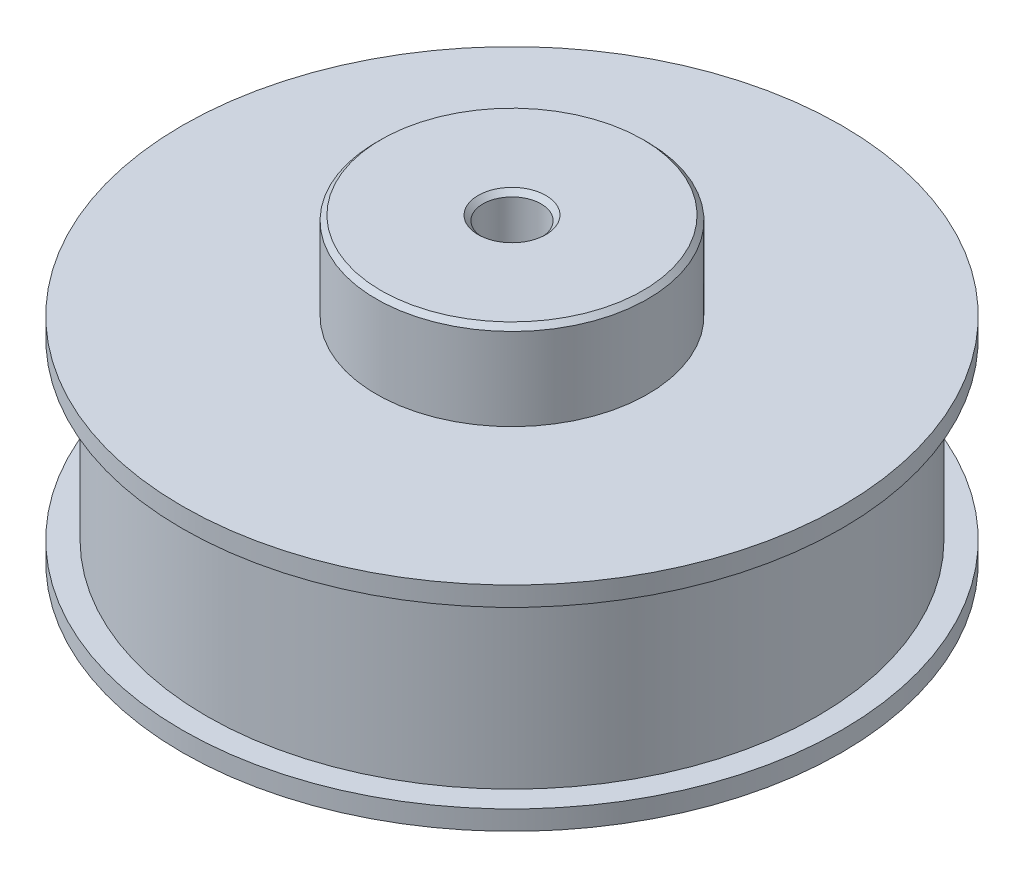
ISO-10303-21;
HEADER;
FILE_DESCRIPTION(('STEP AP214'),'2;1');
FILE_NAME('part.step','',(''),(''),'','','');
FILE_SCHEMA(('AUTOMOTIVE_DESIGN { 1 0 10303 214 1 1 1 1 }'));
ENDSEC;
DATA;
#1=APPLICATION_CONTEXT('core data for automotive mechanical design processes');
#2=APPLICATION_PROTOCOL_DEFINITION('international standard','automotive_design',2000,#1);
#3=PRODUCT_CONTEXT('',#1,'mechanical');
#4=PRODUCT('Part','Part','',(#3));
#5=PRODUCT_RELATED_PRODUCT_CATEGORY('part','',(#4));
#6=PRODUCT_DEFINITION_FORMATION('','',#4);
#7=PRODUCT_DEFINITION_CONTEXT('part definition',#1,'design');
#8=PRODUCT_DEFINITION('design','',#6,#7);
#9=PRODUCT_DEFINITION_SHAPE('','',#8);
#10=(LENGTH_UNIT() NAMED_UNIT(*) SI_UNIT(.MILLI.,.METRE.));
#11=(NAMED_UNIT(*) PLANE_ANGLE_UNIT() SI_UNIT($,.RADIAN.));
#12=(NAMED_UNIT(*) SI_UNIT($,.STERADIAN.) SOLID_ANGLE_UNIT());
#13=UNCERTAINTY_MEASURE_WITH_UNIT(LENGTH_MEASURE(1.E-05),#10,'distance_accuracy_value','');
#14=(GEOMETRIC_REPRESENTATION_CONTEXT(3) GLOBAL_UNCERTAINTY_ASSIGNED_CONTEXT((#13)) GLOBAL_UNIT_ASSIGNED_CONTEXT((#10,
#11,#12)) REPRESENTATION_CONTEXT('',''));
#15=CARTESIAN_POINT('',(0.,0.,0.));
#16=DIRECTION('',(0.,0.,1.));
#17=DIRECTION('',(1.,0.,0.));
#18=AXIS2_PLACEMENT_3D('',#15,#16,#17);
#19=CARTESIAN_POINT('',(0.,22.,0.));
#20=DIRECTION('',(0.,-1.,0.));
#21=DIRECTION('',(0.,0.,1.));
#22=AXIS2_PLACEMENT_3D('',#19,#20,#21);
#23=CYLINDRICAL_SURFACE('',#22,34.);
#24=CARTESIAN_POINT('',(0.,20.,0.));
#25=DIRECTION('',(0.,-1.,0.));
#26=DIRECTION('',(0.,0.,-1.));
#27=AXIS2_PLACEMENT_3D('',#24,#25,#26);
#28=CIRCLE('',#27,34.);
#29=CARTESIAN_POINT('',(0.,20.,-34.));
#30=VERTEX_POINT('',#29);
#31=EDGE_CURVE('E67',#30,#30,#28,.T.);
#32=ORIENTED_EDGE('',*,*,#31,.F.);
#33=EDGE_LOOP('',(#32));
#34=FACE_BOUND('',#33,.T.);
#35=CARTESIAN_POINT('',(0.,22.,0.));
#36=DIRECTION('',(0.,-1.,0.));
#37=DIRECTION('',(0.,0.,-1.));
#38=AXIS2_PLACEMENT_3D('',#35,#36,#37);
#39=CIRCLE('',#38,34.);
#40=CARTESIAN_POINT('',(0.,22.,-34.));
#41=VERTEX_POINT('',#40);
#42=EDGE_CURVE('E57',#41,#41,#39,.T.);
#43=ORIENTED_EDGE('',*,*,#42,.T.);
#44=EDGE_LOOP('',(#43));
#45=FACE_BOUND('',#44,.T.);
#46=ADVANCED_FACE('F37',(#34,#45),#23,.T.);
#47=CARTESIAN_POINT('',(0.,22.,0.));
#48=DIRECTION('',(0.,1.,0.));
#49=DIRECTION('',(0.,0.,-1.));
#50=AXIS2_PLACEMENT_3D('',#47,#48,#49);
#51=PLANE('',#50);
#52=CARTESIAN_POINT('',(0.,22.,0.));
#53=DIRECTION('',(0.,-1.,0.));
#54=DIRECTION('',(0.,0.,-1.));
#55=AXIS2_PLACEMENT_3D('',#52,#53,#54);
#56=CIRCLE('',#55,14.);
#57=CARTESIAN_POINT('',(0.,22.,-14.));
#58=VERTEX_POINT('',#57);
#59=EDGE_CURVE('E73',#58,#58,#56,.T.);
#60=ORIENTED_EDGE('',*,*,#59,.T.);
#61=EDGE_LOOP('',(#60));
#62=FACE_BOUND('',#61,.T.);
#63=ORIENTED_EDGE('',*,*,#42,.F.);
#64=EDGE_LOOP('',(#63));
#65=FACE_BOUND('',#64,.T.);
#66=ADVANCED_FACE('F98',(#62,#65),#51,.T.);
#67=CARTESIAN_POINT('',(0.,20.,0.));
#68=DIRECTION('',(0.,1.,0.));
#69=DIRECTION('',(0.,0.,-1.));
#70=AXIS2_PLACEMENT_3D('',#67,#68,#69);
#71=PLANE('',#70);
#72=CARTESIAN_POINT('',(0.,20.,0.));
#73=DIRECTION('',(0.,-1.,0.));
#74=DIRECTION('',(0.,0.,-1.));
#75=AXIS2_PLACEMENT_3D('',#72,#73,#74);
#76=CIRCLE('',#75,31.5);
#77=CARTESIAN_POINT('',(0.,20.,-31.5));
#78=VERTEX_POINT('',#77);
#79=EDGE_CURVE('E70',#78,#78,#76,.T.);
#80=ORIENTED_EDGE('',*,*,#79,.F.);
#81=EDGE_LOOP('',(#80));
#82=FACE_BOUND('',#81,.T.);
#83=ORIENTED_EDGE('',*,*,#31,.T.);
#84=EDGE_LOOP('',(#83));
#85=FACE_BOUND('',#84,.T.);
#86=ADVANCED_FACE('F105',(#82,#85),#71,.F.);
#87=CARTESIAN_POINT('',(0.,-96.1665222413705,0.));
#88=DIRECTION('',(0.,1.,0.));
#89=DIRECTION('',(0.,0.,-1.));
#90=AXIS2_PLACEMENT_3D('',#87,#88,#89);
#91=CYLINDRICAL_SURFACE('',#90,31.5);
#92=CARTESIAN_POINT('',(0.,2.,0.));
#93=DIRECTION('',(0.,-1.,0.));
#94=DIRECTION('',(0.,0.,-1.));
#95=AXIS2_PLACEMENT_3D('',#92,#93,#94);
#96=CIRCLE('',#95,31.5);
#97=CARTESIAN_POINT('',(0.,2.00000000000002,-31.5));
#98=VERTEX_POINT('',#97);
#99=EDGE_CURVE('E61',#98,#98,#96,.F.);
#100=CARTESIAN_POINT('',(0.,2.00000000000002,-31.5));
#101=CARTESIAN_POINT('',(0.,2.18750000000001,-31.5));
#102=CARTESIAN_POINT('',(0.,2.37500000000001,-31.5));
#103=CARTESIAN_POINT('',(0.,2.75000000000001,-31.5));
#104=CARTESIAN_POINT('',(0.,2.93750000000001,-31.5));
#105=CARTESIAN_POINT('',(0.,3.31250000000001,-31.5));
#106=CARTESIAN_POINT('',(0.,3.50000000000001,-31.5));
#107=CARTESIAN_POINT('',(0.,3.87500000000001,-31.5));
#108=CARTESIAN_POINT('',(0.,4.06250000000002,-31.5));
#109=CARTESIAN_POINT('',(0.,4.43750000000002,-31.5));
#110=CARTESIAN_POINT('',(0.,4.62500000000001,-31.5));
#111=CARTESIAN_POINT('',(0.,5.00000000000001,-31.5));
#112=CARTESIAN_POINT('',(0.,5.18750000000002,-31.5));
#113=CARTESIAN_POINT('',(0.,5.56250000000002,-31.5));
#114=CARTESIAN_POINT('',(0.,5.75000000000001,-31.5));
#115=CARTESIAN_POINT('',(0.,6.12500000000002,-31.5));
#116=CARTESIAN_POINT('',(0.,6.31250000000002,-31.5));
#117=CARTESIAN_POINT('',(0.,6.68750000000002,-31.5));
#118=CARTESIAN_POINT('',(0.,6.87500000000002,-31.5));
#119=CARTESIAN_POINT('',(0.,7.25000000000001,-31.5));
#120=CARTESIAN_POINT('',(0.,7.43750000000001,-31.5));
#121=CARTESIAN_POINT('',(0.,7.81250000000001,-31.5));
#122=CARTESIAN_POINT('',(0.,8.00000000000001,-31.5));
#123=CARTESIAN_POINT('',(0.,8.37500000000001,-31.5));
#124=CARTESIAN_POINT('',(0.,8.56250000000001,-31.5));
#125=CARTESIAN_POINT('',(0.,8.93750000000001,-31.5));
#126=CARTESIAN_POINT('',(0.,9.12500000000001,-31.5));
#127=CARTESIAN_POINT('',(0.,9.50000000000001,-31.5));
#128=CARTESIAN_POINT('',(0.,9.68750000000001,-31.5));
#129=CARTESIAN_POINT('',(0.,10.0625,-31.5));
#130=CARTESIAN_POINT('',(0.,10.25,-31.5));
#131=CARTESIAN_POINT('',(0.,10.625,-31.5));
#132=CARTESIAN_POINT('',(0.,10.8125,-31.5));
#133=CARTESIAN_POINT('',(0.,11.1875,-31.5));
#134=CARTESIAN_POINT('',(0.,11.375,-31.5));
#135=CARTESIAN_POINT('',(0.,11.75,-31.5));
#136=CARTESIAN_POINT('',(0.,11.9375,-31.5));
#137=CARTESIAN_POINT('',(0.,12.3125,-31.5));
#138=CARTESIAN_POINT('',(0.,12.5,-31.5));
#139=CARTESIAN_POINT('',(0.,12.875,-31.5));
#140=CARTESIAN_POINT('',(0.,13.0625,-31.5));
#141=CARTESIAN_POINT('',(0.,13.4375,-31.5));
#142=CARTESIAN_POINT('',(0.,13.625,-31.5));
#143=CARTESIAN_POINT('',(0.,14.,-31.5));
#144=CARTESIAN_POINT('',(0.,14.1875,-31.5));
#145=CARTESIAN_POINT('',(0.,14.5625,-31.5));
#146=CARTESIAN_POINT('',(0.,14.75,-31.5));
#147=CARTESIAN_POINT('',(0.,15.125,-31.5));
#148=CARTESIAN_POINT('',(0.,15.3125,-31.5));
#149=CARTESIAN_POINT('',(0.,15.6875,-31.5));
#150=CARTESIAN_POINT('',(0.,15.875,-31.5));
#151=CARTESIAN_POINT('',(0.,16.25,-31.5));
#152=CARTESIAN_POINT('',(0.,16.4375,-31.5));
#153=CARTESIAN_POINT('',(0.,16.8125,-31.5));
#154=CARTESIAN_POINT('',(0.,17.,-31.5));
#155=CARTESIAN_POINT('',(0.,17.375,-31.5));
#156=CARTESIAN_POINT('',(0.,17.5625,-31.5));
#157=CARTESIAN_POINT('',(0.,17.9375,-31.5));
#158=CARTESIAN_POINT('',(0.,18.125,-31.5));
#159=CARTESIAN_POINT('',(0.,18.5,-31.5));
#160=CARTESIAN_POINT('',(0.,18.6875,-31.5));
#161=CARTESIAN_POINT('',(0.,19.0625,-31.5));
#162=CARTESIAN_POINT('',(0.,19.25,-31.5));
#163=CARTESIAN_POINT('',(0.,19.625,-31.5));
#164=CARTESIAN_POINT('',(0.,19.8125,-31.5));
#165=CARTESIAN_POINT('',(0.,20.,-31.5));
#166=B_SPLINE_CURVE_WITH_KNOTS('',3,(#100,#101,#102,#103,#104,#105,#106,#107,#108,#109,#110,
#111,#112,#113,#114,#115,#116,#117,#118,#119,#120,#121,#122,#123,#124,#125,#126,#127,#128,#129,
#130,#131,#132,#133,#134,#135,#136,#137,#138,#139,#140,#141,#142,#143,#144,#145,#146,#147,#148,
#149,#150,#151,#152,#153,#154,#155,#156,#157,#158,#159,#160,#161,#162,#163,#164,#165),
.UNSPECIFIED.,.F.,.F.,(4,2,2,2,2,2,2,2,2,2,2,2,2,2,2,2,2,2,2,2,2,2,2,2,2,2,2,2,2,2,2,2,4),(0.,
0.562499999999994,1.125,1.68749999999999,2.25,2.8125,3.375,3.9375,4.5,5.0625,5.62499999999999,
6.1875,6.74999999999999,7.3125,7.87499999999999,8.43749999999999,8.99999999999999,9.5625,10.125,
10.6875,11.25,11.8125,12.375,12.9375,13.5,14.0625,14.625,15.1875,15.75,16.3125,16.875,17.4375,
18.),.UNSPECIFIED.);
#167=EDGE_CURVE('BSEAM127',#98,#78,#166,.T.);
#168=ORIENTED_EDGE('',*,*,#99,.T.);
#169=ORIENTED_EDGE('',*,*,#79,.T.);
#170=ORIENTED_EDGE('',*,*,#167,.T.);
#171=ORIENTED_EDGE('',*,*,#167,.F.);
#172=EDGE_LOOP('',(#168,#170,#169,#171));
#173=FACE_BOUND('',#172,.T.);
#174=ADVANCED_FACE('F127',(#173),#91,.T.);
#175=CARTESIAN_POINT('',(0.,2.,0.));
#176=DIRECTION('',(0.,1.,0.));
#177=DIRECTION('',(0.,0.,-1.));
#178=AXIS2_PLACEMENT_3D('',#175,#176,#177);
#179=PLANE('',#178);
#180=CARTESIAN_POINT('',(0.,2.,0.));
#181=DIRECTION('',(0.,-1.,0.));
#182=DIRECTION('',(0.,0.,-1.));
#183=AXIS2_PLACEMENT_3D('',#180,#181,#182);
#184=CIRCLE('',#183,34.);
#185=CARTESIAN_POINT('',(0.,2.,-34.));
#186=VERTEX_POINT('',#185);
#187=EDGE_CURVE('E66',#186,#186,#184,.F.);
#188=ORIENTED_EDGE('',*,*,#187,.T.);
#189=EDGE_LOOP('',(#188));
#190=FACE_BOUND('',#189,.T.);
#191=ORIENTED_EDGE('',*,*,#99,.F.);
#192=EDGE_LOOP('',(#191));
#193=FACE_BOUND('',#192,.T.);
#194=ADVANCED_FACE('F120',(#190,#193),#179,.T.);
#195=CARTESIAN_POINT('',(0.,0.,0.));
#196=DIRECTION('',(0.,1.,0.));
#197=DIRECTION('',(0.,0.,-1.));
#198=AXIS2_PLACEMENT_3D('',#195,#196,#197);
#199=PLANE('',#198);
#200=CARTESIAN_POINT('',(0.,0.,0.));
#201=DIRECTION('',(0.,-1.,0.));
#202=DIRECTION('',(0.,0.,-1.));
#203=AXIS2_PLACEMENT_3D('',#200,#201,#202);
#204=CIRCLE('',#203,3.);
#205=CARTESIAN_POINT('',(0.,0.,-3.));
#206=VERTEX_POINT('',#205);
#207=EDGE_CURVE('E78',#206,#206,#204,.F.);
#208=ORIENTED_EDGE('',*,*,#207,.T.);
#209=EDGE_LOOP('',(#208));
#210=FACE_BOUND('',#209,.T.);
#211=CARTESIAN_POINT('',(0.,0.,0.));
#212=DIRECTION('',(0.,-1.,0.));
#213=DIRECTION('',(0.,0.,-1.));
#214=AXIS2_PLACEMENT_3D('',#211,#212,#213);
#215=CIRCLE('',#214,34.);
#216=CARTESIAN_POINT('',(0.,0.,-34.));
#217=VERTEX_POINT('',#216);
#218=EDGE_CURVE('E58',#217,#217,#215,.T.);
#219=ORIENTED_EDGE('',*,*,#218,.T.);
#220=EDGE_LOOP('',(#219));
#221=FACE_BOUND('',#220,.T.);
#222=ADVANCED_FACE('F82',(#210,#221),#199,.F.);
#223=ORIENTED_EDGE('',*,*,#218,.F.);
#224=EDGE_LOOP('',(#223));
#225=FACE_BOUND('',#224,.T.);
#226=ORIENTED_EDGE('',*,*,#187,.F.);
#227=EDGE_LOOP('',(#226));
#228=FACE_BOUND('',#227,.T.);
#229=ADVANCED_FACE('F101',(#225,#228),#23,.T.);
#230=CARTESIAN_POINT('',(0.,31.,0.));
#231=DIRECTION('',(0.,-1.,0.));
#232=DIRECTION('',(0.,0.,1.));
#233=AXIS2_PLACEMENT_3D('',#230,#231,#232);
#234=CYLINDRICAL_SURFACE('',#233,14.);
#235=CARTESIAN_POINT('',(0.,30.5,0.));
#236=DIRECTION('',(0.,-1.,0.));
#237=DIRECTION('',(0.,0.,-1.));
#238=AXIS2_PLACEMENT_3D('',#235,#236,#237);
#239=CIRCLE('',#238,14.);
#240=CARTESIAN_POINT('',(0.,30.5,-14.));
#241=VERTEX_POINT('',#240);
#242=EDGE_CURVE('E48',#241,#241,#239,.F.);
#243=ORIENTED_EDGE('',*,*,#242,.F.);
#244=EDGE_LOOP('',(#243));
#245=FACE_BOUND('',#244,.T.);
#246=ORIENTED_EDGE('',*,*,#59,.F.);
#247=EDGE_LOOP('',(#246));
#248=FACE_BOUND('',#247,.T.);
#249=ADVANCED_FACE('F112',(#245,#248),#234,.T.);
#250=CARTESIAN_POINT('',(0.,31.,0.));
#251=DIRECTION('',(0.,1.,0.));
#252=DIRECTION('',(0.,0.,-1.));
#253=AXIS2_PLACEMENT_3D('',#250,#251,#252);
#254=PLANE('',#253);
#255=CARTESIAN_POINT('',(0.,31.,0.));
#256=DIRECTION('',(0.,-1.,0.));
#257=DIRECTION('',(0.,0.,-1.));
#258=AXIS2_PLACEMENT_3D('',#255,#256,#257);
#259=CIRCLE('',#258,3.49999999999999);
#260=CARTESIAN_POINT('',(0.,31.,-3.49999999999999));
#261=VERTEX_POINT('',#260);
#262=EDGE_CURVE('E11',#261,#261,#259,.F.);
#263=ORIENTED_EDGE('',*,*,#262,.F.);
#264=EDGE_LOOP('',(#263));
#265=FACE_BOUND('',#264,.T.);
#266=CARTESIAN_POINT('',(0.,31.,0.));
#267=DIRECTION('',(0.,-1.,0.));
#268=DIRECTION('',(0.,0.,-1.));
#269=AXIS2_PLACEMENT_3D('',#266,#267,#268);
#270=CIRCLE('',#269,13.5);
#271=CARTESIAN_POINT('',(0.,31.,-13.5));
#272=VERTEX_POINT('',#271);
#273=EDGE_CURVE('E52',#272,#272,#270,.T.);
#274=ORIENTED_EDGE('',*,*,#273,.F.);
#275=EDGE_LOOP('',(#274));
#276=FACE_BOUND('',#275,.T.);
#277=ADVANCED_FACE('F94',(#265,#276),#254,.T.);
#278=CARTESIAN_POINT('',(0.,31.,0.));
#279=DIRECTION('',(0.,-1.,0.));
#280=DIRECTION('',(0.,0.,1.));
#281=AXIS2_PLACEMENT_3D('',#278,#279,#280);
#282=CONICAL_SURFACE('',#281,13.5,0.785398163397443);
#283=ORIENTED_EDGE('',*,*,#242,.T.);
#284=EDGE_LOOP('',(#283));
#285=FACE_BOUND('',#284,.T.);
#286=ORIENTED_EDGE('',*,*,#273,.T.);
#287=EDGE_LOOP('',(#286));
#288=FACE_BOUND('',#287,.T.);
#289=ADVANCED_FACE('F87',(#285,#288),#282,.T.);
#290=CARTESIAN_POINT('',(0.,-8.48528137423857,0.));
#291=DIRECTION('',(0.,1.,0.));
#292=DIRECTION('',(0.,0.,-1.));
#293=AXIS2_PLACEMENT_3D('',#290,#291,#292);
#294=CYLINDRICAL_SURFACE('',#293,3.);
#295=CARTESIAN_POINT('',(0.,30.5,0.));
#296=DIRECTION('',(0.,-1.,0.));
#297=DIRECTION('',(0.,0.,-1.));
#298=AXIS2_PLACEMENT_3D('',#295,#296,#297);
#299=CIRCLE('',#298,3.);
#300=CARTESIAN_POINT('',(0.,30.5,-3.));
#301=VERTEX_POINT('',#300);
#302=EDGE_CURVE('E44',#301,#301,#299,.T.);
#303=ORIENTED_EDGE('',*,*,#302,.F.);
#304=EDGE_LOOP('',(#303));
#305=FACE_BOUND('',#304,.T.);
#306=ORIENTED_EDGE('',*,*,#207,.F.);
#307=EDGE_LOOP('',(#306));
#308=FACE_BOUND('',#307,.T.);
#309=ADVANCED_FACE('F85',(#305,#308),#294,.F.);
#310=CARTESIAN_POINT('',(0.,30.5,0.));
#311=DIRECTION('',(0.,1.,0.));
#312=DIRECTION('',(0.,0.,-1.));
#313=AXIS2_PLACEMENT_3D('',#310,#311,#312);
#314=CONICAL_SURFACE('',#313,3.,0.785398163397444);
#315=ORIENTED_EDGE('',*,*,#262,.T.);
#316=EDGE_LOOP('',(#315));
#317=FACE_BOUND('',#316,.T.);
#318=ORIENTED_EDGE('',*,*,#302,.T.);
#319=EDGE_LOOP('',(#318));
#320=FACE_BOUND('',#319,.T.);
#321=ADVANCED_FACE('F39',(#317,#320),#314,.F.);
#322=CLOSED_SHELL('',(#46,#66,#86,#174,#194,#222,#229,#249,#277,#289,#309,#321));
#323=MANIFOLD_SOLID_BREP('B2',#322);
#324=ADVANCED_BREP_SHAPE_REPRESENTATION('',(#18,#323),#14);
#325=SHAPE_DEFINITION_REPRESENTATION(#9,#324);
ENDSEC;
END-ISO-10303-21;
